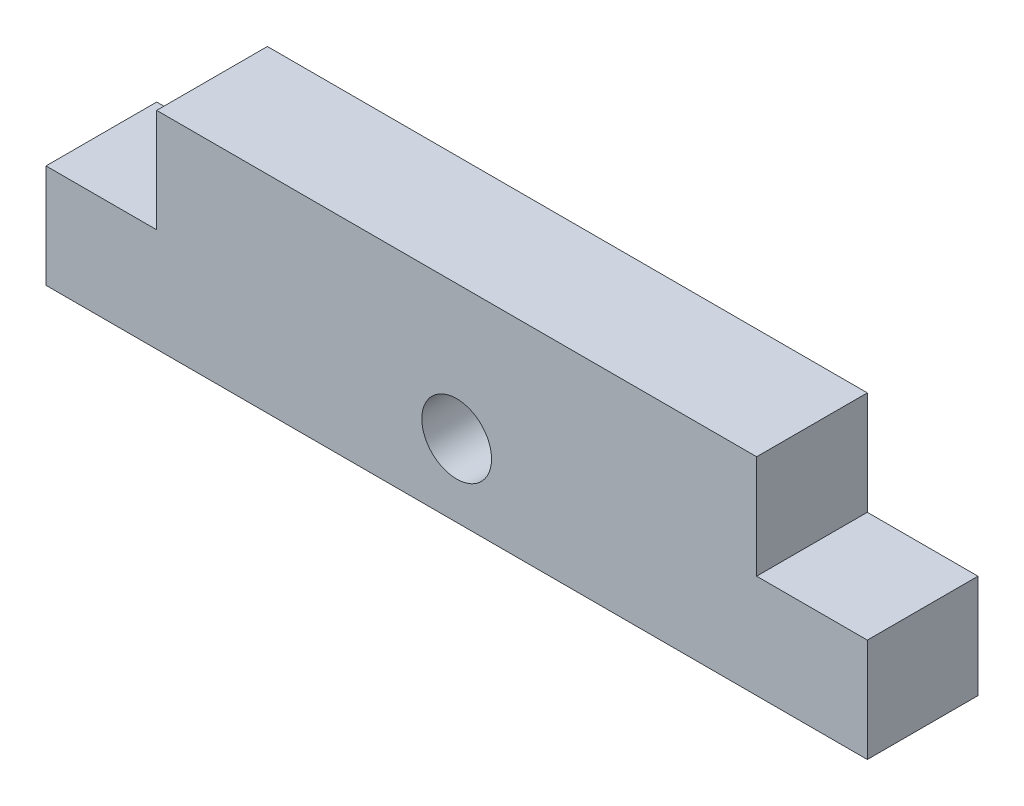
ISO-10303-21;
HEADER;
FILE_DESCRIPTION(('STEP AP214'),'2;1');
FILE_NAME('part.step','',(''),(''),'','','');
FILE_SCHEMA(('AUTOMOTIVE_DESIGN { 1 0 10303 214 1 1 1 1 }'));
ENDSEC;
DATA;
#1=APPLICATION_CONTEXT('core data for automotive mechanical design processes');
#2=APPLICATION_PROTOCOL_DEFINITION('international standard','automotive_design',2000,#1);
#3=PRODUCT_CONTEXT('',#1,'mechanical');
#4=PRODUCT('Part','Part','',(#3));
#5=PRODUCT_RELATED_PRODUCT_CATEGORY('part','',(#4));
#6=PRODUCT_DEFINITION_FORMATION('','',#4);
#7=PRODUCT_DEFINITION_CONTEXT('part definition',#1,'design');
#8=PRODUCT_DEFINITION('design','',#6,#7);
#9=PRODUCT_DEFINITION_SHAPE('','',#8);
#10=(LENGTH_UNIT() NAMED_UNIT(*) SI_UNIT(.MILLI.,.METRE.));
#11=(NAMED_UNIT(*) PLANE_ANGLE_UNIT() SI_UNIT($,.RADIAN.));
#12=(NAMED_UNIT(*) SI_UNIT($,.STERADIAN.) SOLID_ANGLE_UNIT());
#13=UNCERTAINTY_MEASURE_WITH_UNIT(LENGTH_MEASURE(1.E-05),#10,'distance_accuracy_value','');
#14=(GEOMETRIC_REPRESENTATION_CONTEXT(3) GLOBAL_UNCERTAINTY_ASSIGNED_CONTEXT((#13)) GLOBAL_UNIT_ASSIGNED_CONTEXT((#10,
#11,#12)) REPRESENTATION_CONTEXT('',''));
#15=CARTESIAN_POINT('',(0.,0.,0.));
#16=DIRECTION('',(0.,0.,1.));
#17=DIRECTION('',(1.,0.,0.));
#18=AXIS2_PLACEMENT_3D('',#15,#16,#17);
#19=CARTESIAN_POINT('',(0.,0.,5.35));
#20=DIRECTION('',(0.,0.,1.));
#21=DIRECTION('',(1.,0.,0.));
#22=AXIS2_PLACEMENT_3D('',#19,#20,#21);
#23=PLANE('',#22);
#24=DIRECTION('',(-1.,0.,0.));
#25=VECTOR('',#24,1.);
#26=CARTESIAN_POINT('',(34.3500003219,9.99999977650012,5.35));
#27=LINE('',#26,#25);
#28=CARTESIAN_POINT('',(34.3500003219,9.99999977650012,5.35));
#29=VERTEX_POINT('',#28);
#30=CARTESIAN_POINT('',(5.35000022499993,9.99999977650012,5.35));
#31=VERTEX_POINT('',#30);
#32=EDGE_CURVE('E145',#29,#31,#27,.T.);
#33=ORIENTED_EDGE('',*,*,#32,.T.);
#34=DIRECTION('',(0.,-1.,0.));
#35=VECTOR('',#34,1.);
#36=CARTESIAN_POINT('',(5.35000022499993,9.99999977650012,5.35));
#37=LINE('',#36,#35);
#38=CARTESIAN_POINT('',(5.35000022499993,4.99999988819999,5.35));
#39=VERTEX_POINT('',#38);
#40=EDGE_CURVE('E93',#31,#39,#37,.T.);
#41=ORIENTED_EDGE('',*,*,#40,.T.);
#42=DIRECTION('',(-1.,0.,0.));
#43=VECTOR('',#42,1.);
#44=CARTESIAN_POINT('',(5.35000022499993,4.99999988819999,5.35));
#45=LINE('',#44,#43);
#46=CARTESIAN_POINT('',(0.,4.99999988819999,5.35));
#47=VERTEX_POINT('',#46);
#48=EDGE_CURVE('E160',#39,#47,#45,.T.);
#49=ORIENTED_EDGE('',*,*,#48,.T.);
#50=DIRECTION('',(0.,-1.,0.));
#51=VECTOR('',#50,1.);
#52=CARTESIAN_POINT('',(0.,4.99999988819999,5.35));
#53=LINE('',#52,#51);
#54=CARTESIAN_POINT('',(0.,0.,5.35));
#55=VERTEX_POINT('',#54);
#56=EDGE_CURVE('E173',#47,#55,#53,.T.);
#57=ORIENTED_EDGE('',*,*,#56,.T.);
#58=DIRECTION('',(1.,0.,0.));
#59=VECTOR('',#58,1.);
#60=CARTESIAN_POINT('',(0.,0.,5.35));
#61=LINE('',#60,#59);
#62=CARTESIAN_POINT('',(39.7000014782,0.,5.35));
#63=VERTEX_POINT('',#62);
#64=EDGE_CURVE('E112',#55,#63,#61,.T.);
#65=ORIENTED_EDGE('',*,*,#64,.T.);
#66=DIRECTION('',(0.,1.,0.));
#67=VECTOR('',#66,1.);
#68=CARTESIAN_POINT('',(39.7000014782,0.,5.35));
#69=LINE('',#68,#67);
#70=CARTESIAN_POINT('',(39.7000014782,4.9999998882001,5.35));
#71=VERTEX_POINT('',#70);
#72=EDGE_CURVE('E106',#63,#71,#69,.T.);
#73=ORIENTED_EDGE('',*,*,#72,.T.);
#74=DIRECTION('',(-1.,0.,0.));
#75=VECTOR('',#74,1.);
#76=CARTESIAN_POINT('',(39.7000014782,4.9999998882001,5.35));
#77=LINE('',#76,#75);
#78=CARTESIAN_POINT('',(34.3500003219,4.9999998882001,5.35));
#79=VERTEX_POINT('',#78);
#80=EDGE_CURVE('E110',#71,#79,#77,.T.);
#81=ORIENTED_EDGE('',*,*,#80,.T.);
#82=DIRECTION('',(0.,1.,0.));
#83=VECTOR('',#82,1.);
#84=CARTESIAN_POINT('',(34.3500003219,4.9999998882001,5.35));
#85=LINE('',#84,#83);
#86=EDGE_CURVE('E50',#79,#29,#85,.T.);
#87=ORIENTED_EDGE('',*,*,#86,.T.);
#88=EDGE_LOOP('',(#33,#41,#49,#57,#65,#73,#81,#87));
#89=FACE_BOUND('',#88,.T.);
#90=CARTESIAN_POINT('',(19.8499999999999,3.50000000000011,5.35));
#91=DIRECTION('',(0.,0.,1.));
#92=DIRECTION('',(1.,0.,0.));
#93=AXIS2_PLACEMENT_3D('',#90,#91,#92);
#94=CIRCLE('',#93,1.68499999999999);
#95=CARTESIAN_POINT('',(21.5349999999999,3.50000000000011,5.35));
#96=VERTEX_POINT('',#95);
#97=EDGE_CURVE('E134',#96,#96,#94,.T.);
#98=ORIENTED_EDGE('',*,*,#97,.F.);
#99=EDGE_LOOP('',(#98));
#100=FACE_BOUND('',#99,.T.);
#101=ADVANCED_FACE('F33',(#89,#100),#23,.T.);
#102=CARTESIAN_POINT('',(0.,0.,0.));
#103=DIRECTION('',(0.,0.,1.));
#104=DIRECTION('',(1.,0.,0.));
#105=AXIS2_PLACEMENT_3D('',#102,#103,#104);
#106=PLANE('',#105);
#107=DIRECTION('',(-1.,0.,0.));
#108=VECTOR('',#107,1.);
#109=CARTESIAN_POINT('',(34.3500003219,9.99999977650012,0.));
#110=LINE('',#109,#108);
#111=CARTESIAN_POINT('',(34.3500003219,9.99999977650012,0.));
#112=VERTEX_POINT('',#111);
#113=CARTESIAN_POINT('',(5.35000022499993,9.99999977650012,0.));
#114=VERTEX_POINT('',#113);
#115=EDGE_CURVE('E130',#112,#114,#110,.T.);
#116=ORIENTED_EDGE('',*,*,#115,.F.);
#117=DIRECTION('',(0.,1.,0.));
#118=VECTOR('',#117,1.);
#119=CARTESIAN_POINT('',(34.3500003219,4.9999998882001,0.));
#120=LINE('',#119,#118);
#121=CARTESIAN_POINT('',(34.3500003219,4.9999998882001,0.));
#122=VERTEX_POINT('',#121);
#123=EDGE_CURVE('E85',#122,#112,#120,.T.);
#124=ORIENTED_EDGE('',*,*,#123,.F.);
#125=DIRECTION('',(-1.,0.,0.));
#126=VECTOR('',#125,1.);
#127=CARTESIAN_POINT('',(39.7000014782,4.9999998882001,0.));
#128=LINE('',#127,#126);
#129=CARTESIAN_POINT('',(39.7000014782,4.9999998882001,0.));
#130=VERTEX_POINT('',#129);
#131=EDGE_CURVE('E79',#130,#122,#128,.T.);
#132=ORIENTED_EDGE('',*,*,#131,.F.);
#133=DIRECTION('',(0.,1.,0.));
#134=VECTOR('',#133,1.);
#135=CARTESIAN_POINT('',(39.7000014782,0.,0.));
#136=LINE('',#135,#134);
#137=CARTESIAN_POINT('',(39.7000014782,0.,0.));
#138=VERTEX_POINT('',#137);
#139=EDGE_CURVE('E120',#138,#130,#136,.T.);
#140=ORIENTED_EDGE('',*,*,#139,.F.);
#141=DIRECTION('',(1.,0.,0.));
#142=VECTOR('',#141,1.);
#143=CARTESIAN_POINT('',(0.,0.,0.));
#144=LINE('',#143,#142);
#145=CARTESIAN_POINT('',(0.,0.,0.));
#146=VERTEX_POINT('',#145);
#147=EDGE_CURVE('E140',#146,#138,#144,.T.);
#148=ORIENTED_EDGE('',*,*,#147,.F.);
#149=DIRECTION('',(0.,-1.,0.));
#150=VECTOR('',#149,1.);
#151=CARTESIAN_POINT('',(0.,4.99999988819999,0.));
#152=LINE('',#151,#150);
#153=CARTESIAN_POINT('',(0.,4.99999988819999,0.));
#154=VERTEX_POINT('',#153);
#155=EDGE_CURVE('E138',#154,#146,#152,.T.);
#156=ORIENTED_EDGE('',*,*,#155,.F.);
#157=DIRECTION('',(-1.,0.,0.));
#158=VECTOR('',#157,1.);
#159=CARTESIAN_POINT('',(5.35000022499993,4.99999988819999,0.));
#160=LINE('',#159,#158);
#161=CARTESIAN_POINT('',(5.35000022499993,4.99999988819999,0.));
#162=VERTEX_POINT('',#161);
#163=EDGE_CURVE('E136',#162,#154,#160,.T.);
#164=ORIENTED_EDGE('',*,*,#163,.F.);
#165=DIRECTION('',(0.,-1.,0.));
#166=VECTOR('',#165,1.);
#167=CARTESIAN_POINT('',(5.35000022499993,9.99999977650012,0.));
#168=LINE('',#167,#166);
#169=EDGE_CURVE('E133',#114,#162,#168,.T.);
#170=ORIENTED_EDGE('',*,*,#169,.F.);
#171=EDGE_LOOP('',(#116,#124,#132,#140,#148,#156,#164,#170));
#172=FACE_BOUND('',#171,.T.);
#173=CARTESIAN_POINT('',(19.8499999999999,3.50000000000011,0.));
#174=DIRECTION('',(0.,0.,1.));
#175=DIRECTION('',(1.,0.,0.));
#176=AXIS2_PLACEMENT_3D('',#173,#174,#175);
#177=CIRCLE('',#176,1.68499999999999);
#178=CARTESIAN_POINT('',(21.5349999999999,3.50000000000011,0.));
#179=VERTEX_POINT('',#178);
#180=EDGE_CURVE('E179',#179,#179,#177,.T.);
#181=ORIENTED_EDGE('',*,*,#180,.T.);
#182=EDGE_LOOP('',(#181));
#183=FACE_BOUND('',#182,.T.);
#184=ADVANCED_FACE('F164',(#172,#183),#106,.F.);
#185=CARTESIAN_POINT('',(34.3500003219,9.99999977650012,5.35));
#186=DIRECTION('',(0.,-1.,0.));
#187=DIRECTION('',(0.,0.,-1.));
#188=AXIS2_PLACEMENT_3D('',#185,#186,#187);
#189=PLANE('',#188);
#190=ORIENTED_EDGE('',*,*,#115,.T.);
#191=DIRECTION('',(0.,0.,-1.));
#192=VECTOR('',#191,1.);
#193=CARTESIAN_POINT('',(5.35000022499993,9.99999977650012,5.35));
#194=LINE('',#193,#192);
#195=EDGE_CURVE('E11',#31,#114,#194,.T.);
#196=ORIENTED_EDGE('',*,*,#195,.F.);
#197=ORIENTED_EDGE('',*,*,#32,.F.);
#198=DIRECTION('',(0.,0.,-1.));
#199=VECTOR('',#198,1.);
#200=CARTESIAN_POINT('',(34.3500003219,9.99999977650012,5.35));
#201=LINE('',#200,#199);
#202=EDGE_CURVE('E126',#29,#112,#201,.T.);
#203=ORIENTED_EDGE('',*,*,#202,.T.);
#204=EDGE_LOOP('',(#190,#196,#197,#203));
#205=FACE_BOUND('',#204,.T.);
#206=ADVANCED_FACE('F35',(#205),#189,.F.);
#207=CARTESIAN_POINT('',(5.35000022499993,9.99999977650012,5.35));
#208=DIRECTION('',(1.,0.,0.));
#209=DIRECTION('',(0.,0.,-1.));
#210=AXIS2_PLACEMENT_3D('',#207,#208,#209);
#211=PLANE('',#210);
#212=ORIENTED_EDGE('',*,*,#169,.T.);
#213=DIRECTION('',(0.,0.,-1.));
#214=VECTOR('',#213,1.);
#215=CARTESIAN_POINT('',(5.35000022499993,4.99999988819999,5.35));
#216=LINE('',#215,#214);
#217=EDGE_CURVE('E42',#39,#162,#216,.T.);
#218=ORIENTED_EDGE('',*,*,#217,.F.);
#219=ORIENTED_EDGE('',*,*,#40,.F.);
#220=ORIENTED_EDGE('',*,*,#195,.T.);
#221=EDGE_LOOP('',(#212,#218,#219,#220));
#222=FACE_BOUND('',#221,.T.);
#223=ADVANCED_FACE('F207',(#222),#211,.F.);
#224=CARTESIAN_POINT('',(5.35000022499993,4.99999988819999,5.35));
#225=DIRECTION('',(0.,-1.,0.));
#226=DIRECTION('',(0.,0.,-1.));
#227=AXIS2_PLACEMENT_3D('',#224,#225,#226);
#228=PLANE('',#227);
#229=ORIENTED_EDGE('',*,*,#163,.T.);
#230=DIRECTION('',(0.,0.,-1.));
#231=VECTOR('',#230,1.);
#232=CARTESIAN_POINT('',(0.,4.99999988819999,5.35));
#233=LINE('',#232,#231);
#234=EDGE_CURVE('E152',#47,#154,#233,.T.);
#235=ORIENTED_EDGE('',*,*,#234,.F.);
#236=ORIENTED_EDGE('',*,*,#48,.F.);
#237=ORIENTED_EDGE('',*,*,#217,.T.);
#238=EDGE_LOOP('',(#229,#235,#236,#237));
#239=FACE_BOUND('',#238,.T.);
#240=ADVANCED_FACE('F158',(#239),#228,.F.);
#241=CARTESIAN_POINT('',(0.,4.99999988819999,5.35));
#242=DIRECTION('',(1.,0.,0.));
#243=DIRECTION('',(0.,0.,-1.));
#244=AXIS2_PLACEMENT_3D('',#241,#242,#243);
#245=PLANE('',#244);
#246=ORIENTED_EDGE('',*,*,#155,.T.);
#247=DIRECTION('',(0.,0.,-1.));
#248=VECTOR('',#247,1.);
#249=CARTESIAN_POINT('',(0.,0.,5.35));
#250=LINE('',#249,#248);
#251=EDGE_CURVE('E149',#55,#146,#250,.T.);
#252=ORIENTED_EDGE('',*,*,#251,.F.);
#253=ORIENTED_EDGE('',*,*,#56,.F.);
#254=ORIENTED_EDGE('',*,*,#234,.T.);
#255=EDGE_LOOP('',(#246,#252,#253,#254));
#256=FACE_BOUND('',#255,.T.);
#257=ADVANCED_FACE('F169',(#256),#245,.F.);
#258=CARTESIAN_POINT('',(0.,0.,5.35));
#259=DIRECTION('',(0.,1.,0.));
#260=DIRECTION('',(0.,0.,1.));
#261=AXIS2_PLACEMENT_3D('',#258,#259,#260);
#262=PLANE('',#261);
#263=ORIENTED_EDGE('',*,*,#147,.T.);
#264=DIRECTION('',(0.,0.,-1.));
#265=VECTOR('',#264,1.);
#266=CARTESIAN_POINT('',(39.7000014782,0.,5.35));
#267=LINE('',#266,#265);
#268=EDGE_CURVE('E121',#63,#138,#267,.T.);
#269=ORIENTED_EDGE('',*,*,#268,.F.);
#270=ORIENTED_EDGE('',*,*,#64,.F.);
#271=ORIENTED_EDGE('',*,*,#251,.T.);
#272=EDGE_LOOP('',(#263,#269,#270,#271));
#273=FACE_BOUND('',#272,.T.);
#274=ADVANCED_FACE('F172',(#273),#262,.F.);
#275=CARTESIAN_POINT('',(39.7000014782,0.,5.35));
#276=DIRECTION('',(-1.,0.,0.));
#277=DIRECTION('',(0.,0.,1.));
#278=AXIS2_PLACEMENT_3D('',#275,#276,#277);
#279=PLANE('',#278);
#280=ORIENTED_EDGE('',*,*,#139,.T.);
#281=DIRECTION('',(0.,0.,-1.));
#282=VECTOR('',#281,1.);
#283=CARTESIAN_POINT('',(39.7000014782,4.9999998882001,5.35));
#284=LINE('',#283,#282);
#285=EDGE_CURVE('E117',#71,#130,#284,.T.);
#286=ORIENTED_EDGE('',*,*,#285,.F.);
#287=ORIENTED_EDGE('',*,*,#72,.F.);
#288=ORIENTED_EDGE('',*,*,#268,.T.);
#289=EDGE_LOOP('',(#280,#286,#287,#288));
#290=FACE_BOUND('',#289,.T.);
#291=ADVANCED_FACE('F118',(#290),#279,.F.);
#292=CARTESIAN_POINT('',(39.7000014782,4.9999998882001,5.35));
#293=DIRECTION('',(0.,-1.,0.));
#294=DIRECTION('',(0.,0.,-1.));
#295=AXIS2_PLACEMENT_3D('',#292,#293,#294);
#296=PLANE('',#295);
#297=ORIENTED_EDGE('',*,*,#131,.T.);
#298=DIRECTION('',(0.,0.,-1.));
#299=VECTOR('',#298,1.);
#300=CARTESIAN_POINT('',(34.3500003219,4.9999998882001,5.35));
#301=LINE('',#300,#299);
#302=EDGE_CURVE('E122',#79,#122,#301,.T.);
#303=ORIENTED_EDGE('',*,*,#302,.F.);
#304=ORIENTED_EDGE('',*,*,#80,.F.);
#305=ORIENTED_EDGE('',*,*,#285,.T.);
#306=EDGE_LOOP('',(#297,#303,#304,#305));
#307=FACE_BOUND('',#306,.T.);
#308=ADVANCED_FACE('F124',(#307),#296,.F.);
#309=CARTESIAN_POINT('',(34.3500003219,4.9999998882001,5.35));
#310=DIRECTION('',(-1.,0.,0.));
#311=DIRECTION('',(0.,0.,1.));
#312=AXIS2_PLACEMENT_3D('',#309,#310,#311);
#313=PLANE('',#312);
#314=ORIENTED_EDGE('',*,*,#123,.T.);
#315=ORIENTED_EDGE('',*,*,#202,.F.);
#316=ORIENTED_EDGE('',*,*,#86,.F.);
#317=ORIENTED_EDGE('',*,*,#302,.T.);
#318=EDGE_LOOP('',(#314,#315,#316,#317));
#319=FACE_BOUND('',#318,.T.);
#320=ADVANCED_FACE('F195',(#319),#313,.F.);
#321=CARTESIAN_POINT('',(19.8499999999999,3.50000000000011,5.35));
#322=DIRECTION('',(0.,0.,-1.));
#323=DIRECTION('',(-1.,0.,0.));
#324=AXIS2_PLACEMENT_3D('',#321,#322,#323);
#325=CYLINDRICAL_SURFACE('',#324,1.68499999999999);
#326=ORIENTED_EDGE('',*,*,#97,.T.);
#327=EDGE_LOOP('',(#326));
#328=FACE_BOUND('',#327,.T.);
#329=ORIENTED_EDGE('',*,*,#180,.F.);
#330=EDGE_LOOP('',(#329));
#331=FACE_BOUND('',#330,.T.);
#332=ADVANCED_FACE('F185',(#328,#331),#325,.F.);
#333=CLOSED_SHELL('',(#101,#184,#206,#223,#240,#257,#274,#291,#308,#320,#332));
#334=MANIFOLD_SOLID_BREP('B2',#333);
#335=ADVANCED_BREP_SHAPE_REPRESENTATION('',(#18,#334),#14);
#336=SHAPE_DEFINITION_REPRESENTATION(#9,#335);
ENDSEC;
END-ISO-10303-21;
